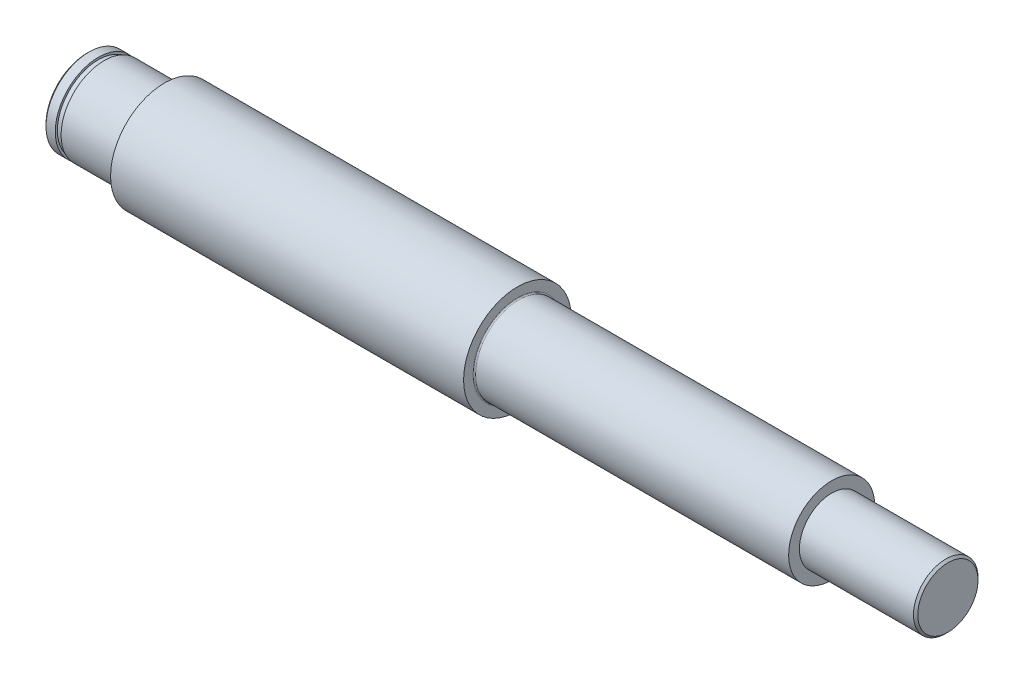
ISO-10303-21;
HEADER;
FILE_DESCRIPTION(('STEP AP214'),'2;1');
FILE_NAME('part.step','',(''),(''),'','','');
FILE_SCHEMA(('AUTOMOTIVE_DESIGN { 1 0 10303 214 1 1 1 1 }'));
ENDSEC;
DATA;
#1=APPLICATION_CONTEXT('core data for automotive mechanical design processes');
#2=APPLICATION_PROTOCOL_DEFINITION('international standard','automotive_design',2000,#1);
#3=PRODUCT_CONTEXT('',#1,'mechanical');
#4=PRODUCT('Part','Part','',(#3));
#5=PRODUCT_RELATED_PRODUCT_CATEGORY('part','',(#4));
#6=PRODUCT_DEFINITION_FORMATION('','',#4);
#7=PRODUCT_DEFINITION_CONTEXT('part definition',#1,'design');
#8=PRODUCT_DEFINITION('design','',#6,#7);
#9=PRODUCT_DEFINITION_SHAPE('','',#8);
#10=(LENGTH_UNIT() NAMED_UNIT(*) SI_UNIT(.MILLI.,.METRE.));
#11=(NAMED_UNIT(*) PLANE_ANGLE_UNIT() SI_UNIT($,.RADIAN.));
#12=(NAMED_UNIT(*) SI_UNIT($,.STERADIAN.) SOLID_ANGLE_UNIT());
#13=UNCERTAINTY_MEASURE_WITH_UNIT(LENGTH_MEASURE(1.E-05),#10,'distance_accuracy_value','');
#14=(GEOMETRIC_REPRESENTATION_CONTEXT(3) GLOBAL_UNCERTAINTY_ASSIGNED_CONTEXT((#13)) GLOBAL_UNIT_ASSIGNED_CONTEXT((#10,
#11,#12)) REPRESENTATION_CONTEXT('',''));
#15=CARTESIAN_POINT('',(0.,0.,0.));
#16=DIRECTION('',(0.,0.,1.));
#17=DIRECTION('',(1.,0.,0.));
#18=AXIS2_PLACEMENT_3D('',#15,#16,#17);
#19=CARTESIAN_POINT('',(0.,0.,0.));
#20=DIRECTION('',(-1.,0.,0.));
#21=DIRECTION('',(0.,0.,1.));
#22=AXIS2_PLACEMENT_3D('',#19,#20,#21);
#23=CYLINDRICAL_SURFACE('',#22,10.);
#24=CARTESIAN_POINT('',(17.7,0.,0.));
#25=DIRECTION('',(1.,0.,0.));
#26=DIRECTION('',(0.,0.,-1.));
#27=AXIS2_PLACEMENT_3D('',#24,#25,#26);
#28=CIRCLE('',#27,10.);
#29=CARTESIAN_POINT('',(17.7,0.,-10.));
#30=VERTEX_POINT('',#29);
#31=EDGE_CURVE('E59',#30,#30,#28,.F.);
#32=ORIENTED_EDGE('',*,*,#31,.T.);
#33=EDGE_LOOP('',(#32));
#34=FACE_BOUND('',#33,.T.);
#35=CARTESIAN_POINT('',(4.,0.,0.));
#36=DIRECTION('',(-1.,0.,0.));
#37=DIRECTION('',(0.,0.,1.));
#38=AXIS2_PLACEMENT_3D('',#35,#36,#37);
#39=CIRCLE('',#38,10.);
#40=CARTESIAN_POINT('',(4.,0.,10.));
#41=VERTEX_POINT('',#40);
#42=EDGE_CURVE('E68',#41,#41,#39,.T.);
#43=ORIENTED_EDGE('',*,*,#42,.F.);
#44=EDGE_LOOP('',(#43));
#45=FACE_BOUND('',#44,.T.);
#46=ADVANCED_FACE('F36',(#34,#45),#23,.T.);
#47=CARTESIAN_POINT('',(4.,10.,0.));
#48=DIRECTION('',(1.,0.,0.));
#49=DIRECTION('',(0.,0.,-1.));
#50=AXIS2_PLACEMENT_3D('',#47,#48,#49);
#51=PLANE('',#50);
#52=CARTESIAN_POINT('',(4.,0.,0.));
#53=DIRECTION('',(-1.,0.,0.));
#54=DIRECTION('',(0.,0.,1.));
#55=AXIS2_PLACEMENT_3D('',#52,#53,#54);
#56=CIRCLE('',#55,9.5);
#57=CARTESIAN_POINT('',(4.,0.,9.5));
#58=VERTEX_POINT('',#57);
#59=EDGE_CURVE('E71',#58,#58,#56,.T.);
#60=ORIENTED_EDGE('',*,*,#59,.F.);
#61=EDGE_LOOP('',(#60));
#62=FACE_BOUND('',#61,.T.);
#63=ORIENTED_EDGE('',*,*,#42,.T.);
#64=EDGE_LOOP('',(#63));
#65=FACE_BOUND('',#64,.T.);
#66=ADVANCED_FACE('F113',(#62,#65),#51,.F.);
#67=CARTESIAN_POINT('',(0.,0.,0.));
#68=DIRECTION('',(-1.,0.,0.));
#69=DIRECTION('',(0.,0.,1.));
#70=AXIS2_PLACEMENT_3D('',#67,#68,#69);
#71=CYLINDRICAL_SURFACE('',#70,9.5);
#72=CARTESIAN_POINT('',(2.65000000000001,0.,0.));
#73=DIRECTION('',(-1.,0.,0.));
#74=DIRECTION('',(0.,0.,1.));
#75=AXIS2_PLACEMENT_3D('',#72,#73,#74);
#76=CIRCLE('',#75,9.5);
#77=CARTESIAN_POINT('',(2.65000000000001,0.,9.5));
#78=VERTEX_POINT('',#77);
#79=EDGE_CURVE('E74',#78,#78,#76,.T.);
#80=ORIENTED_EDGE('',*,*,#79,.F.);
#81=EDGE_LOOP('',(#80));
#82=FACE_BOUND('',#81,.T.);
#83=ORIENTED_EDGE('',*,*,#59,.T.);
#84=EDGE_LOOP('',(#83));
#85=FACE_BOUND('',#84,.T.);
#86=ADVANCED_FACE('F119',(#82,#85),#71,.T.);
#87=CARTESIAN_POINT('',(2.65000000000001,9.5,0.));
#88=DIRECTION('',(-1.,0.,0.));
#89=DIRECTION('',(0.,0.,1.));
#90=AXIS2_PLACEMENT_3D('',#87,#88,#89);
#91=PLANE('',#90);
#92=CARTESIAN_POINT('',(2.65000000000001,0.,0.));
#93=DIRECTION('',(-1.,0.,0.));
#94=DIRECTION('',(0.,0.,1.));
#95=AXIS2_PLACEMENT_3D('',#92,#93,#94);
#96=CIRCLE('',#95,10.);
#97=CARTESIAN_POINT('',(2.65000000000001,0.,10.));
#98=VERTEX_POINT('',#97);
#99=EDGE_CURVE('E77',#98,#98,#96,.T.);
#100=ORIENTED_EDGE('',*,*,#99,.F.);
#101=EDGE_LOOP('',(#100));
#102=FACE_BOUND('',#101,.T.);
#103=ORIENTED_EDGE('',*,*,#79,.T.);
#104=EDGE_LOOP('',(#103));
#105=FACE_BOUND('',#104,.T.);
#106=ADVANCED_FACE('F154',(#102,#105),#91,.F.);
#107=CARTESIAN_POINT('',(0.,0.,0.));
#108=DIRECTION('',(-1.,0.,0.));
#109=DIRECTION('',(0.,0.,1.));
#110=AXIS2_PLACEMENT_3D('',#107,#108,#109);
#111=CYLINDRICAL_SURFACE('',#110,10.);
#112=CARTESIAN_POINT('',(0.499999999999997,0.,0.));
#113=DIRECTION('',(1.,0.,0.));
#114=DIRECTION('',(0.,0.,-1.));
#115=AXIS2_PLACEMENT_3D('',#112,#113,#114);
#116=CIRCLE('',#115,10.);
#117=CARTESIAN_POINT('',(0.499999999999997,0.,-10.));
#118=VERTEX_POINT('',#117);
#119=EDGE_CURVE('E47',#118,#118,#116,.T.);
#120=ORIENTED_EDGE('',*,*,#119,.T.);
#121=EDGE_LOOP('',(#120));
#122=FACE_BOUND('',#121,.T.);
#123=ORIENTED_EDGE('',*,*,#99,.T.);
#124=EDGE_LOOP('',(#123));
#125=FACE_BOUND('',#124,.T.);
#126=ADVANCED_FACE('F146',(#122,#125),#111,.T.);
#127=CARTESIAN_POINT('',(0.,10.,0.));
#128=DIRECTION('',(1.,0.,0.));
#129=DIRECTION('',(0.,0.,-1.));
#130=AXIS2_PLACEMENT_3D('',#127,#128,#129);
#131=PLANE('',#130);
#132=CARTESIAN_POINT('',(0.,0.,0.));
#133=DIRECTION('',(1.,0.,0.));
#134=DIRECTION('',(0.,0.,-1.));
#135=AXIS2_PLACEMENT_3D('',#132,#133,#134);
#136=CIRCLE('',#135,9.50000000000001);
#137=CARTESIAN_POINT('',(0.,0.,-9.50000000000001));
#138=VERTEX_POINT('',#137);
#139=EDGE_CURVE('E51',#138,#138,#136,.F.);
#140=ORIENTED_EDGE('',*,*,#139,.T.);
#141=EDGE_LOOP('',(#140));
#142=FACE_BOUND('',#141,.T.);
#143=ADVANCED_FACE('F143',(#142),#131,.F.);
#144=CARTESIAN_POINT('',(200.,0.,0.));
#145=DIRECTION('',(-1.,0.,0.));
#146=DIRECTION('',(0.,0.,1.));
#147=AXIS2_PLACEMENT_3D('',#144,#145,#146);
#148=PLANE('',#147);
#149=CARTESIAN_POINT('',(200.,0.,0.));
#150=DIRECTION('',(-1.,0.,0.));
#151=DIRECTION('',(0.,0.,1.));
#152=AXIS2_PLACEMENT_3D('',#149,#150,#151);
#153=CIRCLE('',#152,7.00000000000006);
#154=CARTESIAN_POINT('',(200.,0.,7.00000000000006));
#155=VERTEX_POINT('',#154);
#156=EDGE_CURVE('E10',#155,#155,#153,.F.);
#157=ORIENTED_EDGE('',*,*,#156,.T.);
#158=EDGE_LOOP('',(#157));
#159=FACE_BOUND('',#158,.T.);
#160=ADVANCED_FACE('F145',(#159),#148,.F.);
#161=CARTESIAN_POINT('',(0.,0.,0.));
#162=DIRECTION('',(-1.,0.,0.));
#163=DIRECTION('',(0.,0.,1.));
#164=AXIS2_PLACEMENT_3D('',#161,#162,#163);
#165=CYLINDRICAL_SURFACE('',#164,7.5);
#166=CARTESIAN_POINT('',(199.5,0.,0.));
#167=DIRECTION('',(-1.,0.,0.));
#168=DIRECTION('',(0.,0.,1.));
#169=AXIS2_PLACEMENT_3D('',#166,#167,#168);
#170=CIRCLE('',#169,7.5);
#171=CARTESIAN_POINT('',(199.5,0.,7.5));
#172=VERTEX_POINT('',#171);
#173=EDGE_CURVE('E43',#172,#172,#170,.T.);
#174=ORIENTED_EDGE('',*,*,#173,.T.);
#175=EDGE_LOOP('',(#174));
#176=FACE_BOUND('',#175,.T.);
#177=CARTESIAN_POINT('',(173.,0.,0.));
#178=DIRECTION('',(-1.,0.,0.));
#179=DIRECTION('',(0.,0.,1.));
#180=AXIS2_PLACEMENT_3D('',#177,#178,#179);
#181=CIRCLE('',#180,7.5);
#182=CARTESIAN_POINT('',(173.,0.,7.5));
#183=VERTEX_POINT('',#182);
#184=EDGE_CURVE('E80',#183,#183,#181,.T.);
#185=ORIENTED_EDGE('',*,*,#184,.F.);
#186=EDGE_LOOP('',(#185));
#187=FACE_BOUND('',#186,.T.);
#188=ADVANCED_FACE('F152',(#176,#187),#165,.T.);
#189=CARTESIAN_POINT('',(173.,7.5,0.));
#190=DIRECTION('',(-1.,0.,0.));
#191=DIRECTION('',(0.,0.,1.));
#192=AXIS2_PLACEMENT_3D('',#189,#190,#191);
#193=PLANE('',#192);
#194=CARTESIAN_POINT('',(173.,0.,0.));
#195=DIRECTION('',(-1.,0.,0.));
#196=DIRECTION('',(0.,0.,1.));
#197=AXIS2_PLACEMENT_3D('',#194,#195,#196);
#198=CIRCLE('',#197,10.);
#199=CARTESIAN_POINT('',(173.,0.,10.));
#200=VERTEX_POINT('',#199);
#201=EDGE_CURVE('E83',#200,#200,#198,.T.);
#202=ORIENTED_EDGE('',*,*,#201,.F.);
#203=EDGE_LOOP('',(#202));
#204=FACE_BOUND('',#203,.T.);
#205=ORIENTED_EDGE('',*,*,#184,.T.);
#206=EDGE_LOOP('',(#205));
#207=FACE_BOUND('',#206,.T.);
#208=ADVANCED_FACE('F109',(#204,#207),#193,.F.);
#209=CARTESIAN_POINT('',(0.,0.,0.));
#210=DIRECTION('',(-1.,0.,0.));
#211=DIRECTION('',(0.,0.,1.));
#212=AXIS2_PLACEMENT_3D('',#209,#210,#211);
#213=CYLINDRICAL_SURFACE('',#212,9.99999999999999);
#214=CARTESIAN_POINT('',(100.3,0.,0.));
#215=DIRECTION('',(-1.,0.,0.));
#216=DIRECTION('',(0.,0.,1.));
#217=AXIS2_PLACEMENT_3D('',#214,#215,#216);
#218=CIRCLE('',#217,9.99999999999999);
#219=CARTESIAN_POINT('',(100.3,0.,9.99999999999999));
#220=VERTEX_POINT('',#219);
#221=EDGE_CURVE('E62',#220,#220,#218,.F.);
#222=ORIENTED_EDGE('',*,*,#221,.T.);
#223=EDGE_LOOP('',(#222));
#224=FACE_BOUND('',#223,.T.);
#225=ORIENTED_EDGE('',*,*,#201,.T.);
#226=EDGE_LOOP('',(#225));
#227=FACE_BOUND('',#226,.T.);
#228=ADVANCED_FACE('F103',(#224,#227),#213,.T.);
#229=CARTESIAN_POINT('',(100.,9.99999999999999,0.));
#230=DIRECTION('',(-1.,0.,0.));
#231=DIRECTION('',(0.,0.,1.));
#232=AXIS2_PLACEMENT_3D('',#229,#230,#231);
#233=PLANE('',#232);
#234=CARTESIAN_POINT('',(100.,0.,0.));
#235=DIRECTION('',(-1.,0.,0.));
#236=DIRECTION('',(0.,0.,1.));
#237=AXIS2_PLACEMENT_3D('',#234,#235,#236);
#238=CIRCLE('',#237,10.3);
#239=CARTESIAN_POINT('',(100.,0.,10.3));
#240=VERTEX_POINT('',#239);
#241=EDGE_CURVE('E65',#240,#240,#238,.T.);
#242=ORIENTED_EDGE('',*,*,#241,.T.);
#243=EDGE_LOOP('',(#242));
#244=FACE_BOUND('',#243,.T.);
#245=CARTESIAN_POINT('',(100.,0.,0.));
#246=DIRECTION('',(-1.,0.,0.));
#247=DIRECTION('',(0.,0.,1.));
#248=AXIS2_PLACEMENT_3D('',#245,#246,#247);
#249=CIRCLE('',#248,12.5);
#250=CARTESIAN_POINT('',(100.,0.,12.5));
#251=VERTEX_POINT('',#250);
#252=EDGE_CURVE('E86',#251,#251,#249,.T.);
#253=ORIENTED_EDGE('',*,*,#252,.F.);
#254=EDGE_LOOP('',(#253));
#255=FACE_BOUND('',#254,.T.);
#256=ADVANCED_FACE('F98',(#244,#255),#233,.F.);
#257=CARTESIAN_POINT('',(0.,0.,0.));
#258=DIRECTION('',(-1.,0.,0.));
#259=DIRECTION('',(0.,0.,1.));
#260=AXIS2_PLACEMENT_3D('',#257,#258,#259);
#261=CYLINDRICAL_SURFACE('',#260,12.5);
#262=CARTESIAN_POINT('',(18.,0.,0.));
#263=DIRECTION('',(-1.,0.,0.));
#264=DIRECTION('',(0.,0.,1.));
#265=AXIS2_PLACEMENT_3D('',#262,#263,#264);
#266=CIRCLE('',#265,12.5);
#267=CARTESIAN_POINT('',(18.,0.,12.5));
#268=VERTEX_POINT('',#267);
#269=EDGE_CURVE('E89',#268,#268,#266,.T.);
#270=ORIENTED_EDGE('',*,*,#269,.F.);
#271=EDGE_LOOP('',(#270));
#272=FACE_BOUND('',#271,.T.);
#273=ORIENTED_EDGE('',*,*,#252,.T.);
#274=EDGE_LOOP('',(#273));
#275=FACE_BOUND('',#274,.T.);
#276=ADVANCED_FACE('F95',(#272,#275),#261,.T.);
#277=CARTESIAN_POINT('',(18.,12.5,0.));
#278=DIRECTION('',(1.,0.,0.));
#279=DIRECTION('',(0.,0.,-1.));
#280=AXIS2_PLACEMENT_3D('',#277,#278,#279);
#281=PLANE('',#280);
#282=CARTESIAN_POINT('',(18.,0.,0.));
#283=DIRECTION('',(1.,0.,0.));
#284=DIRECTION('',(0.,0.,-1.));
#285=AXIS2_PLACEMENT_3D('',#282,#283,#284);
#286=CIRCLE('',#285,10.3);
#287=CARTESIAN_POINT('',(18.,0.,-10.3));
#288=VERTEX_POINT('',#287);
#289=EDGE_CURVE('E56',#288,#288,#286,.T.);
#290=ORIENTED_EDGE('',*,*,#289,.T.);
#291=EDGE_LOOP('',(#290));
#292=FACE_BOUND('',#291,.T.);
#293=ORIENTED_EDGE('',*,*,#269,.T.);
#294=EDGE_LOOP('',(#293));
#295=FACE_BOUND('',#294,.T.);
#296=ADVANCED_FACE('F93',(#292,#295),#281,.F.);
#297=CARTESIAN_POINT('',(100.3,0.,0.));
#298=DIRECTION('',(-1.,0.,0.));
#299=DIRECTION('',(0.,0.,1.));
#300=AXIS2_PLACEMENT_3D('',#297,#298,#299);
#301=TOROIDAL_SURFACE('',#300,10.3,0.3);
#302=ORIENTED_EDGE('',*,*,#221,.F.);
#303=EDGE_LOOP('',(#302));
#304=FACE_BOUND('',#303,.T.);
#305=ORIENTED_EDGE('',*,*,#241,.F.);
#306=EDGE_LOOP('',(#305));
#307=FACE_BOUND('',#306,.T.);
#308=ADVANCED_FACE('F125',(#304,#307),#301,.F.);
#309=CARTESIAN_POINT('',(17.7,0.,0.));
#310=DIRECTION('',(1.,0.,0.));
#311=DIRECTION('',(0.,0.,-1.));
#312=AXIS2_PLACEMENT_3D('',#309,#310,#311);
#313=TOROIDAL_SURFACE('',#312,10.3,0.3);
#314=ORIENTED_EDGE('',*,*,#289,.F.);
#315=EDGE_LOOP('',(#314));
#316=FACE_BOUND('',#315,.T.);
#317=ORIENTED_EDGE('',*,*,#31,.F.);
#318=EDGE_LOOP('',(#317));
#319=FACE_BOUND('',#318,.T.);
#320=ADVANCED_FACE('F128',(#316,#319),#313,.F.);
#321=CARTESIAN_POINT('',(0.,0.,0.));
#322=DIRECTION('',(1.,0.,0.));
#323=DIRECTION('',(0.,0.,-1.));
#324=AXIS2_PLACEMENT_3D('',#321,#322,#323);
#325=CONICAL_SURFACE('',#324,9.50000000000001,0.785398163397441);
#326=ORIENTED_EDGE('',*,*,#119,.F.);
#327=EDGE_LOOP('',(#326));
#328=FACE_BOUND('',#327,.T.);
#329=ORIENTED_EDGE('',*,*,#139,.F.);
#330=EDGE_LOOP('',(#329));
#331=FACE_BOUND('',#330,.T.);
#332=ADVANCED_FACE('F131',(#328,#331),#325,.T.);
#333=CARTESIAN_POINT('',(199.5,0.,0.));
#334=DIRECTION('',(-1.,0.,0.));
#335=DIRECTION('',(0.,0.,1.));
#336=AXIS2_PLACEMENT_3D('',#333,#334,#335);
#337=CONICAL_SURFACE('',#336,7.5,0.78539816339744);
#338=ORIENTED_EDGE('',*,*,#156,.F.);
#339=EDGE_LOOP('',(#338));
#340=FACE_BOUND('',#339,.T.);
#341=ORIENTED_EDGE('',*,*,#173,.F.);
#342=EDGE_LOOP('',(#341));
#343=FACE_BOUND('',#342,.T.);
#344=ADVANCED_FACE('F38',(#340,#343),#337,.T.);
#345=CLOSED_SHELL('',(#46,#66,#86,#106,#126,#143,#160,#188,#208,#228,#256,#276,#296,#308,#320,
#332,#344));
#346=MANIFOLD_SOLID_BREP('B2',#345);
#347=ADVANCED_BREP_SHAPE_REPRESENTATION('',(#18,#346),#14);
#348=SHAPE_DEFINITION_REPRESENTATION(#9,#347);
ENDSEC;
END-ISO-10303-21;
